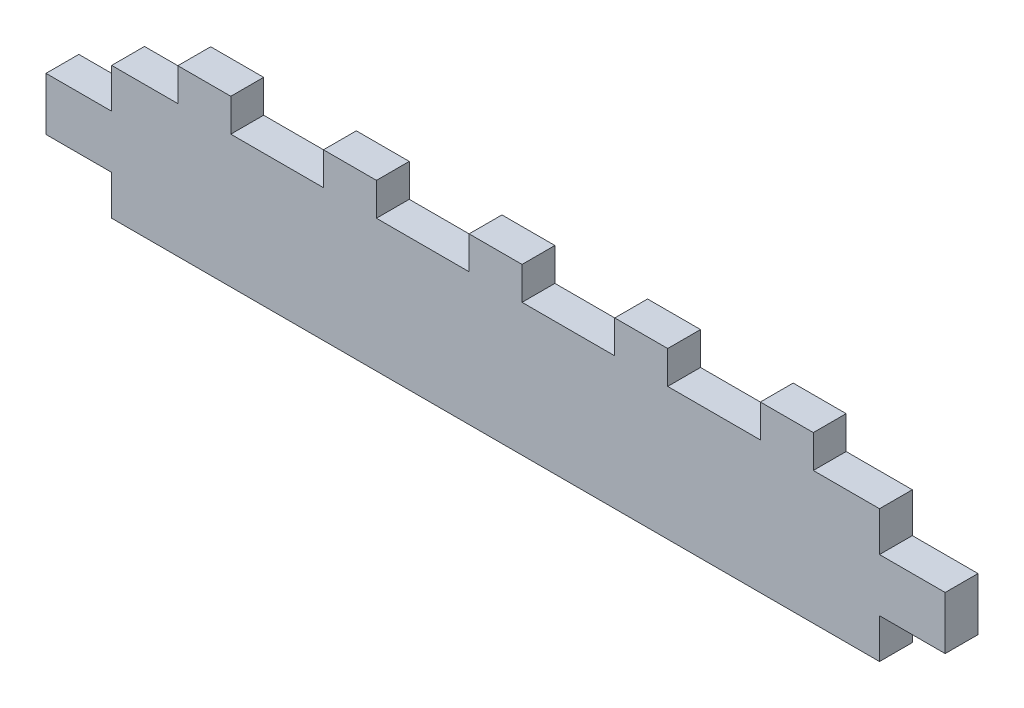
ISO-10303-21;
HEADER;
FILE_DESCRIPTION(('STEP AP214'),'2;1');
FILE_NAME('part.step','',(''),(''),'','','');
FILE_SCHEMA(('AUTOMOTIVE_DESIGN { 1 0 10303 214 1 1 1 1 }'));
ENDSEC;
DATA;
#1=APPLICATION_CONTEXT('core data for automotive mechanical design processes');
#2=APPLICATION_PROTOCOL_DEFINITION('international standard','automotive_design',2000,#1);
#3=PRODUCT_CONTEXT('',#1,'mechanical');
#4=PRODUCT('Part','Part','',(#3));
#5=PRODUCT_RELATED_PRODUCT_CATEGORY('part','',(#4));
#6=PRODUCT_DEFINITION_FORMATION('','',#4);
#7=PRODUCT_DEFINITION_CONTEXT('part definition',#1,'design');
#8=PRODUCT_DEFINITION('design','',#6,#7);
#9=PRODUCT_DEFINITION_SHAPE('','',#8);
#10=(LENGTH_UNIT() NAMED_UNIT(*) SI_UNIT(.MILLI.,.METRE.));
#11=(NAMED_UNIT(*) PLANE_ANGLE_UNIT() SI_UNIT($,.RADIAN.));
#12=(NAMED_UNIT(*) SI_UNIT($,.STERADIAN.) SOLID_ANGLE_UNIT());
#13=UNCERTAINTY_MEASURE_WITH_UNIT(LENGTH_MEASURE(1.E-05),#10,'distance_accuracy_value','');
#14=(GEOMETRIC_REPRESENTATION_CONTEXT(3) GLOBAL_UNCERTAINTY_ASSIGNED_CONTEXT((#13)) GLOBAL_UNIT_ASSIGNED_CONTEXT((#10,
#11,#12)) REPRESENTATION_CONTEXT('',''));
#15=CARTESIAN_POINT('',(0.,0.,0.));
#16=DIRECTION('',(0.,0.,1.));
#17=DIRECTION('',(1.,0.,0.));
#18=AXIS2_PLACEMENT_3D('',#15,#16,#17);
#19=CARTESIAN_POINT('',(-145.,0.,12.4));
#20=DIRECTION('',(1.,0.,0.));
#21=DIRECTION('',(0.,1.,0.));
#22=AXIS2_PLACEMENT_3D('',#19,#20,#21);
#23=PLANE('',#22);
#24=DIRECTION('',(0.,-1.,0.));
#25=VECTOR('',#24,1.);
#26=CARTESIAN_POINT('',(-145.,0.,0.));
#27=LINE('',#26,#25);
#28=CARTESIAN_POINT('',(-145.,15.,0.));
#29=VERTEX_POINT('',#28);
#30=CARTESIAN_POINT('',(-145.,0.,0.));
#31=VERTEX_POINT('',#30);
#32=EDGE_CURVE('E273',#29,#31,#27,.T.);
#33=ORIENTED_EDGE('',*,*,#32,.T.);
#34=DIRECTION('',(0.,0.,-1.));
#35=VECTOR('',#34,1.);
#36=CARTESIAN_POINT('',(-145.,0.,12.4));
#37=LINE('',#36,#35);
#38=CARTESIAN_POINT('',(-145.,0.,12.4));
#39=VERTEX_POINT('',#38);
#40=EDGE_CURVE('E11',#39,#31,#37,.T.);
#41=ORIENTED_EDGE('',*,*,#40,.F.);
#42=DIRECTION('',(0.,-1.,0.));
#43=VECTOR('',#42,1.);
#44=CARTESIAN_POINT('',(-145.,0.,12.4));
#45=LINE('',#44,#43);
#46=CARTESIAN_POINT('',(-145.,15.,12.4));
#47=VERTEX_POINT('',#46);
#48=EDGE_CURVE('E335',#47,#39,#45,.T.);
#49=ORIENTED_EDGE('',*,*,#48,.F.);
#50=DIRECTION('',(0.,0.,-1.));
#51=VECTOR('',#50,1.);
#52=CARTESIAN_POINT('',(-145.,15.,12.4));
#53=LINE('',#52,#51);
#54=EDGE_CURVE('E269',#47,#29,#53,.T.);
#55=ORIENTED_EDGE('',*,*,#54,.T.);
#56=EDGE_LOOP('',(#33,#41,#49,#55));
#57=FACE_BOUND('',#56,.T.);
#58=ADVANCED_FACE('F33',(#57),#23,.F.);
#59=CARTESIAN_POINT('',(-145.,0.,12.4));
#60=DIRECTION('',(0.,1.,0.));
#61=DIRECTION('',(-1.,0.,0.));
#62=AXIS2_PLACEMENT_3D('',#59,#60,#61);
#63=PLANE('',#62);
#64=DIRECTION('',(1.,0.,0.));
#65=VECTOR('',#64,1.);
#66=CARTESIAN_POINT('',(-145.,0.,0.));
#67=LINE('',#66,#65);
#68=CARTESIAN_POINT('',(145.,0.,0.));
#69=VERTEX_POINT('',#68);
#70=EDGE_CURVE('E276',#31,#69,#67,.T.);
#71=ORIENTED_EDGE('',*,*,#70,.T.);
#72=DIRECTION('',(0.,0.,-1.));
#73=VECTOR('',#72,1.);
#74=CARTESIAN_POINT('',(145.,0.,12.4));
#75=LINE('',#74,#73);
#76=CARTESIAN_POINT('',(145.,0.,12.4));
#77=VERTEX_POINT('',#76);
#78=EDGE_CURVE('E41',#77,#69,#75,.T.);
#79=ORIENTED_EDGE('',*,*,#78,.F.);
#80=DIRECTION('',(1.,0.,0.));
#81=VECTOR('',#80,1.);
#82=CARTESIAN_POINT('',(-145.,0.,12.4));
#83=LINE('',#82,#81);
#84=EDGE_CURVE('E164',#39,#77,#83,.T.);
#85=ORIENTED_EDGE('',*,*,#84,.F.);
#86=ORIENTED_EDGE('',*,*,#40,.T.);
#87=EDGE_LOOP('',(#71,#79,#85,#86));
#88=FACE_BOUND('',#87,.T.);
#89=ADVANCED_FACE('F513',(#88),#63,.F.);
#90=CARTESIAN_POINT('',(145.,0.,12.4));
#91=DIRECTION('',(-1.,0.,0.));
#92=DIRECTION('',(0.,-1.,0.));
#93=AXIS2_PLACEMENT_3D('',#90,#91,#92);
#94=PLANE('',#93);
#95=DIRECTION('',(0.,1.,0.));
#96=VECTOR('',#95,1.);
#97=CARTESIAN_POINT('',(145.,0.,0.));
#98=LINE('',#97,#96);
#99=CARTESIAN_POINT('',(145.,15.,0.));
#100=VERTEX_POINT('',#99);
#101=EDGE_CURVE('E278',#69,#100,#98,.T.);
#102=ORIENTED_EDGE('',*,*,#101,.T.);
#103=DIRECTION('',(0.,0.,-1.));
#104=VECTOR('',#103,1.);
#105=CARTESIAN_POINT('',(145.,15.,12.4));
#106=LINE('',#105,#104);
#107=CARTESIAN_POINT('',(145.,15.,12.4));
#108=VERTEX_POINT('',#107);
#109=EDGE_CURVE('E414',#108,#100,#106,.T.);
#110=ORIENTED_EDGE('',*,*,#109,.F.);
#111=DIRECTION('',(0.,1.,0.));
#112=VECTOR('',#111,1.);
#113=CARTESIAN_POINT('',(145.,0.,12.4));
#114=LINE('',#113,#112);
#115=EDGE_CURVE('E422',#77,#108,#114,.T.);
#116=ORIENTED_EDGE('',*,*,#115,.F.);
#117=ORIENTED_EDGE('',*,*,#78,.T.);
#118=EDGE_LOOP('',(#102,#110,#116,#117));
#119=FACE_BOUND('',#118,.T.);
#120=ADVANCED_FACE('F420',(#119),#94,.F.);
#121=CARTESIAN_POINT('',(145.,15.,12.4));
#122=DIRECTION('',(0.,1.,0.));
#123=DIRECTION('',(-1.,0.,0.));
#124=AXIS2_PLACEMENT_3D('',#121,#122,#123);
#125=PLANE('',#124);
#126=DIRECTION('',(1.,0.,0.));
#127=VECTOR('',#126,1.);
#128=CARTESIAN_POINT('',(145.,15.,0.));
#129=LINE('',#128,#127);
#130=CARTESIAN_POINT('',(169.8,15.,0.));
#131=VERTEX_POINT('',#130);
#132=EDGE_CURVE('E280',#100,#131,#129,.T.);
#133=ORIENTED_EDGE('',*,*,#132,.T.);
#134=DIRECTION('',(0.,0.,-1.));
#135=VECTOR('',#134,1.);
#136=CARTESIAN_POINT('',(169.8,15.,12.4));
#137=LINE('',#136,#135);
#138=CARTESIAN_POINT('',(169.8,15.,12.4));
#139=VERTEX_POINT('',#138);
#140=EDGE_CURVE('E411',#139,#131,#137,.T.);
#141=ORIENTED_EDGE('',*,*,#140,.F.);
#142=DIRECTION('',(1.,0.,0.));
#143=VECTOR('',#142,1.);
#144=CARTESIAN_POINT('',(145.,15.,12.4));
#145=LINE('',#144,#143);
#146=EDGE_CURVE('E440',#108,#139,#145,.T.);
#147=ORIENTED_EDGE('',*,*,#146,.F.);
#148=ORIENTED_EDGE('',*,*,#109,.T.);
#149=EDGE_LOOP('',(#133,#141,#147,#148));
#150=FACE_BOUND('',#149,.T.);
#151=ADVANCED_FACE('F431',(#150),#125,.F.);
#152=CARTESIAN_POINT('',(169.8,15.,12.4));
#153=DIRECTION('',(-1.,0.,0.));
#154=DIRECTION('',(0.,-1.,0.));
#155=AXIS2_PLACEMENT_3D('',#152,#153,#154);
#156=PLANE('',#155);
#157=DIRECTION('',(0.,1.,0.));
#158=VECTOR('',#157,1.);
#159=CARTESIAN_POINT('',(169.8,15.,0.));
#160=LINE('',#159,#158);
#161=CARTESIAN_POINT('',(169.8,35.,0.));
#162=VERTEX_POINT('',#161);
#163=EDGE_CURVE('E282',#131,#162,#160,.T.);
#164=ORIENTED_EDGE('',*,*,#163,.T.);
#165=DIRECTION('',(0.,0.,-1.));
#166=VECTOR('',#165,1.);
#167=CARTESIAN_POINT('',(169.8,35.,12.4));
#168=LINE('',#167,#166);
#169=CARTESIAN_POINT('',(169.8,35.,12.4));
#170=VERTEX_POINT('',#169);
#171=EDGE_CURVE('E408',#170,#162,#168,.T.);
#172=ORIENTED_EDGE('',*,*,#171,.F.);
#173=DIRECTION('',(0.,1.,0.));
#174=VECTOR('',#173,1.);
#175=CARTESIAN_POINT('',(169.8,15.,12.4));
#176=LINE('',#175,#174);
#177=EDGE_CURVE('E437',#139,#170,#176,.T.);
#178=ORIENTED_EDGE('',*,*,#177,.F.);
#179=ORIENTED_EDGE('',*,*,#140,.T.);
#180=EDGE_LOOP('',(#164,#172,#178,#179));
#181=FACE_BOUND('',#180,.T.);
#182=ADVANCED_FACE('F435',(#181),#156,.F.);
#183=CARTESIAN_POINT('',(145.,35.,12.4));
#184=DIRECTION('',(0.,-1.,0.));
#185=DIRECTION('',(1.,0.,0.));
#186=AXIS2_PLACEMENT_3D('',#183,#184,#185);
#187=PLANE('',#186);
#188=DIRECTION('',(-1.,0.,0.));
#189=VECTOR('',#188,1.);
#190=CARTESIAN_POINT('',(145.,35.,0.));
#191=LINE('',#190,#189);
#192=CARTESIAN_POINT('',(145.,35.,0.));
#193=VERTEX_POINT('',#192);
#194=EDGE_CURVE('E284',#162,#193,#191,.T.);
#195=ORIENTED_EDGE('',*,*,#194,.T.);
#196=DIRECTION('',(0.,0.,-1.));
#197=VECTOR('',#196,1.);
#198=CARTESIAN_POINT('',(145.,35.,12.4));
#199=LINE('',#198,#197);
#200=CARTESIAN_POINT('',(145.,35.,12.4));
#201=VERTEX_POINT('',#200);
#202=EDGE_CURVE('E405',#201,#193,#199,.T.);
#203=ORIENTED_EDGE('',*,*,#202,.F.);
#204=DIRECTION('',(-1.,0.,0.));
#205=VECTOR('',#204,1.);
#206=CARTESIAN_POINT('',(145.,35.,12.4));
#207=LINE('',#206,#205);
#208=EDGE_CURVE('E439',#170,#201,#207,.T.);
#209=ORIENTED_EDGE('',*,*,#208,.F.);
#210=ORIENTED_EDGE('',*,*,#171,.T.);
#211=EDGE_LOOP('',(#195,#203,#209,#210));
#212=FACE_BOUND('',#211,.T.);
#213=ADVANCED_FACE('F526',(#212),#187,.F.);
#214=CARTESIAN_POINT('',(145.,35.,12.4));
#215=DIRECTION('',(-1.,0.,0.));
#216=DIRECTION('',(0.,0.,1.));
#217=AXIS2_PLACEMENT_3D('',#214,#215,#216);
#218=PLANE('',#217);
#219=DIRECTION('',(0.,1.,0.));
#220=VECTOR('',#219,1.);
#221=CARTESIAN_POINT('',(145.,35.,0.));
#222=LINE('',#221,#220);
#223=CARTESIAN_POINT('',(145.,50.,0.));
#224=VERTEX_POINT('',#223);
#225=EDGE_CURVE('E286',#193,#224,#222,.T.);
#226=ORIENTED_EDGE('',*,*,#225,.T.);
#227=DIRECTION('',(0.,0.,-1.));
#228=VECTOR('',#227,1.);
#229=CARTESIAN_POINT('',(145.,50.,12.4));
#230=LINE('',#229,#228);
#231=CARTESIAN_POINT('',(145.,50.,12.4));
#232=VERTEX_POINT('',#231);
#233=EDGE_CURVE('E402',#232,#224,#230,.T.);
#234=ORIENTED_EDGE('',*,*,#233,.F.);
#235=DIRECTION('',(0.,1.,0.));
#236=VECTOR('',#235,1.);
#237=CARTESIAN_POINT('',(145.,35.,12.4));
#238=LINE('',#237,#236);
#239=EDGE_CURVE('E442',#201,#232,#238,.T.);
#240=ORIENTED_EDGE('',*,*,#239,.F.);
#241=ORIENTED_EDGE('',*,*,#202,.T.);
#242=EDGE_LOOP('',(#226,#234,#240,#241));
#243=FACE_BOUND('',#242,.T.);
#244=ADVANCED_FACE('F529',(#243),#218,.F.);
#245=CARTESIAN_POINT('',(120.,50.,12.4));
#246=DIRECTION('',(0.,-1.,0.));
#247=DIRECTION('',(1.,0.,0.));
#248=AXIS2_PLACEMENT_3D('',#245,#246,#247);
#249=PLANE('',#248);
#250=DIRECTION('',(-1.,0.,0.));
#251=VECTOR('',#250,1.);
#252=CARTESIAN_POINT('',(120.,50.,0.));
#253=LINE('',#252,#251);
#254=CARTESIAN_POINT('',(120.,50.,0.));
#255=VERTEX_POINT('',#254);
#256=EDGE_CURVE('E288',#224,#255,#253,.T.);
#257=ORIENTED_EDGE('',*,*,#256,.T.);
#258=DIRECTION('',(0.,0.,-1.));
#259=VECTOR('',#258,1.);
#260=CARTESIAN_POINT('',(120.,50.,12.4));
#261=LINE('',#260,#259);
#262=CARTESIAN_POINT('',(120.,50.,12.4));
#263=VERTEX_POINT('',#262);
#264=EDGE_CURVE('E399',#263,#255,#261,.T.);
#265=ORIENTED_EDGE('',*,*,#264,.F.);
#266=DIRECTION('',(-1.,0.,0.));
#267=VECTOR('',#266,1.);
#268=CARTESIAN_POINT('',(120.,50.,12.4));
#269=LINE('',#268,#267);
#270=EDGE_CURVE('E448',#232,#263,#269,.T.);
#271=ORIENTED_EDGE('',*,*,#270,.F.);
#272=ORIENTED_EDGE('',*,*,#233,.T.);
#273=EDGE_LOOP('',(#257,#265,#271,#272));
#274=FACE_BOUND('',#273,.T.);
#275=ADVANCED_FACE('F533',(#274),#249,.F.);
#276=CARTESIAN_POINT('',(120.,62.4,12.4));
#277=DIRECTION('',(-1.,0.,0.));
#278=DIRECTION('',(0.,0.,1.));
#279=AXIS2_PLACEMENT_3D('',#276,#277,#278);
#280=PLANE('',#279);
#281=DIRECTION('',(0.,1.,0.));
#282=VECTOR('',#281,1.);
#283=CARTESIAN_POINT('',(120.,62.4,0.));
#284=LINE('',#283,#282);
#285=CARTESIAN_POINT('',(120.,62.4,0.));
#286=VERTEX_POINT('',#285);
#287=EDGE_CURVE('E290',#255,#286,#284,.T.);
#288=ORIENTED_EDGE('',*,*,#287,.T.);
#289=DIRECTION('',(0.,0.,-1.));
#290=VECTOR('',#289,1.);
#291=CARTESIAN_POINT('',(120.,62.4,12.4));
#292=LINE('',#291,#290);
#293=CARTESIAN_POINT('',(120.,62.4,12.4));
#294=VERTEX_POINT('',#293);
#295=EDGE_CURVE('E396',#294,#286,#292,.T.);
#296=ORIENTED_EDGE('',*,*,#295,.F.);
#297=DIRECTION('',(0.,1.,0.));
#298=VECTOR('',#297,1.);
#299=CARTESIAN_POINT('',(120.,62.4,12.4));
#300=LINE('',#299,#298);
#301=EDGE_CURVE('E450',#263,#294,#300,.T.);
#302=ORIENTED_EDGE('',*,*,#301,.F.);
#303=ORIENTED_EDGE('',*,*,#264,.T.);
#304=EDGE_LOOP('',(#288,#296,#302,#303));
#305=FACE_BOUND('',#304,.T.);
#306=ADVANCED_FACE('F537',(#305),#280,.F.);
#307=CARTESIAN_POINT('',(120.,62.4,12.4));
#308=DIRECTION('',(0.,-1.,0.));
#309=DIRECTION('',(0.,0.,-1.));
#310=AXIS2_PLACEMENT_3D('',#307,#308,#309);
#311=PLANE('',#310);
#312=DIRECTION('',(-1.,0.,0.));
#313=VECTOR('',#312,1.);
#314=CARTESIAN_POINT('',(120.,62.4,0.));
#315=LINE('',#314,#313);
#316=CARTESIAN_POINT('',(100.,62.4,0.));
#317=VERTEX_POINT('',#316);
#318=EDGE_CURVE('E292',#286,#317,#315,.T.);
#319=ORIENTED_EDGE('',*,*,#318,.T.);
#320=DIRECTION('',(0.,0.,-1.));
#321=VECTOR('',#320,1.);
#322=CARTESIAN_POINT('',(100.,62.4,12.4));
#323=LINE('',#322,#321);
#324=CARTESIAN_POINT('',(100.,62.4,12.4));
#325=VERTEX_POINT('',#324);
#326=EDGE_CURVE('E393',#325,#317,#323,.T.);
#327=ORIENTED_EDGE('',*,*,#326,.F.);
#328=DIRECTION('',(-1.,0.,0.));
#329=VECTOR('',#328,1.);
#330=CARTESIAN_POINT('',(120.,62.4,12.4));
#331=LINE('',#330,#329);
#332=EDGE_CURVE('E452',#294,#325,#331,.T.);
#333=ORIENTED_EDGE('',*,*,#332,.F.);
#334=ORIENTED_EDGE('',*,*,#295,.T.);
#335=EDGE_LOOP('',(#319,#327,#333,#334));
#336=FACE_BOUND('',#335,.T.);
#337=ADVANCED_FACE('F541',(#336),#311,.F.);
#338=CARTESIAN_POINT('',(100.,62.4,12.4));
#339=DIRECTION('',(1.,0.,0.));
#340=DIRECTION('',(0.,1.,0.));
#341=AXIS2_PLACEMENT_3D('',#338,#339,#340);
#342=PLANE('',#341);
#343=DIRECTION('',(0.,-1.,0.));
#344=VECTOR('',#343,1.);
#345=CARTESIAN_POINT('',(100.,62.4,0.));
#346=LINE('',#345,#344);
#347=CARTESIAN_POINT('',(100.,50.,0.));
#348=VERTEX_POINT('',#347);
#349=EDGE_CURVE('E294',#317,#348,#346,.T.);
#350=ORIENTED_EDGE('',*,*,#349,.T.);
#351=DIRECTION('',(0.,0.,-1.));
#352=VECTOR('',#351,1.);
#353=CARTESIAN_POINT('',(100.,50.,12.4));
#354=LINE('',#353,#352);
#355=CARTESIAN_POINT('',(100.,50.,12.4));
#356=VERTEX_POINT('',#355);
#357=EDGE_CURVE('E390',#356,#348,#354,.T.);
#358=ORIENTED_EDGE('',*,*,#357,.F.);
#359=DIRECTION('',(0.,-1.,0.));
#360=VECTOR('',#359,1.);
#361=CARTESIAN_POINT('',(100.,62.4,12.4));
#362=LINE('',#361,#360);
#363=EDGE_CURVE('E454',#325,#356,#362,.T.);
#364=ORIENTED_EDGE('',*,*,#363,.F.);
#365=ORIENTED_EDGE('',*,*,#326,.T.);
#366=EDGE_LOOP('',(#350,#358,#364,#365));
#367=FACE_BOUND('',#366,.T.);
#368=ADVANCED_FACE('F545',(#367),#342,.F.);
#369=CARTESIAN_POINT('',(65.,50.,12.4));
#370=DIRECTION('',(0.,-1.,0.));
#371=DIRECTION('',(0.,0.,-1.));
#372=AXIS2_PLACEMENT_3D('',#369,#370,#371);
#373=PLANE('',#372);
#374=DIRECTION('',(-1.,0.,0.));
#375=VECTOR('',#374,1.);
#376=CARTESIAN_POINT('',(65.,50.,0.));
#377=LINE('',#376,#375);
#378=CARTESIAN_POINT('',(65.,50.,0.));
#379=VERTEX_POINT('',#378);
#380=EDGE_CURVE('E296',#348,#379,#377,.T.);
#381=ORIENTED_EDGE('',*,*,#380,.T.);
#382=DIRECTION('',(0.,0.,-1.));
#383=VECTOR('',#382,1.);
#384=CARTESIAN_POINT('',(65.,50.,12.4));
#385=LINE('',#384,#383);
#386=CARTESIAN_POINT('',(65.,50.,12.4));
#387=VERTEX_POINT('',#386);
#388=EDGE_CURVE('E387',#387,#379,#385,.T.);
#389=ORIENTED_EDGE('',*,*,#388,.F.);
#390=DIRECTION('',(-1.,0.,0.));
#391=VECTOR('',#390,1.);
#392=CARTESIAN_POINT('',(65.,50.,12.4));
#393=LINE('',#392,#391);
#394=EDGE_CURVE('E456',#356,#387,#393,.T.);
#395=ORIENTED_EDGE('',*,*,#394,.F.);
#396=ORIENTED_EDGE('',*,*,#357,.T.);
#397=EDGE_LOOP('',(#381,#389,#395,#396));
#398=FACE_BOUND('',#397,.T.);
#399=ADVANCED_FACE('F549',(#398),#373,.F.);
#400=CARTESIAN_POINT('',(65.,62.4,12.4));
#401=DIRECTION('',(-1.,0.,0.));
#402=DIRECTION('',(0.,0.,1.));
#403=AXIS2_PLACEMENT_3D('',#400,#401,#402);
#404=PLANE('',#403);
#405=DIRECTION('',(0.,1.,0.));
#406=VECTOR('',#405,1.);
#407=CARTESIAN_POINT('',(65.,62.4,0.));
#408=LINE('',#407,#406);
#409=CARTESIAN_POINT('',(65.,62.4,0.));
#410=VERTEX_POINT('',#409);
#411=EDGE_CURVE('E298',#379,#410,#408,.T.);
#412=ORIENTED_EDGE('',*,*,#411,.T.);
#413=DIRECTION('',(0.,0.,-1.));
#414=VECTOR('',#413,1.);
#415=CARTESIAN_POINT('',(65.,62.4,12.4));
#416=LINE('',#415,#414);
#417=CARTESIAN_POINT('',(65.,62.4,12.4));
#418=VERTEX_POINT('',#417);
#419=EDGE_CURVE('E384',#418,#410,#416,.T.);
#420=ORIENTED_EDGE('',*,*,#419,.F.);
#421=DIRECTION('',(0.,1.,0.));
#422=VECTOR('',#421,1.);
#423=CARTESIAN_POINT('',(65.,62.4,12.4));
#424=LINE('',#423,#422);
#425=EDGE_CURVE('E458',#387,#418,#424,.T.);
#426=ORIENTED_EDGE('',*,*,#425,.F.);
#427=ORIENTED_EDGE('',*,*,#388,.T.);
#428=EDGE_LOOP('',(#412,#420,#426,#427));
#429=FACE_BOUND('',#428,.T.);
#430=ADVANCED_FACE('F553',(#429),#404,.F.);
#431=CARTESIAN_POINT('',(65.,62.4,12.4));
#432=DIRECTION('',(0.,-1.,0.));
#433=DIRECTION('',(0.,0.,-1.));
#434=AXIS2_PLACEMENT_3D('',#431,#432,#433);
#435=PLANE('',#434);
#436=DIRECTION('',(-1.,0.,0.));
#437=VECTOR('',#436,1.);
#438=CARTESIAN_POINT('',(65.,62.4,0.));
#439=LINE('',#438,#437);
#440=CARTESIAN_POINT('',(45.,62.4,0.));
#441=VERTEX_POINT('',#440);
#442=EDGE_CURVE('E300',#410,#441,#439,.T.);
#443=ORIENTED_EDGE('',*,*,#442,.T.);
#444=DIRECTION('',(0.,0.,-1.));
#445=VECTOR('',#444,1.);
#446=CARTESIAN_POINT('',(45.,62.4,12.4));
#447=LINE('',#446,#445);
#448=CARTESIAN_POINT('',(45.,62.4,12.4));
#449=VERTEX_POINT('',#448);
#450=EDGE_CURVE('E381',#449,#441,#447,.T.);
#451=ORIENTED_EDGE('',*,*,#450,.F.);
#452=DIRECTION('',(-1.,0.,0.));
#453=VECTOR('',#452,1.);
#454=CARTESIAN_POINT('',(65.,62.4,12.4));
#455=LINE('',#454,#453);
#456=EDGE_CURVE('E460',#418,#449,#455,.T.);
#457=ORIENTED_EDGE('',*,*,#456,.F.);
#458=ORIENTED_EDGE('',*,*,#419,.T.);
#459=EDGE_LOOP('',(#443,#451,#457,#458));
#460=FACE_BOUND('',#459,.T.);
#461=ADVANCED_FACE('F557',(#460),#435,.F.);
#462=CARTESIAN_POINT('',(45.,62.4,12.4));
#463=DIRECTION('',(1.,0.,0.));
#464=DIRECTION('',(0.,1.,0.));
#465=AXIS2_PLACEMENT_3D('',#462,#463,#464);
#466=PLANE('',#465);
#467=DIRECTION('',(0.,-1.,0.));
#468=VECTOR('',#467,1.);
#469=CARTESIAN_POINT('',(45.,62.4,0.));
#470=LINE('',#469,#468);
#471=CARTESIAN_POINT('',(45.,50.,0.));
#472=VERTEX_POINT('',#471);
#473=EDGE_CURVE('E302',#441,#472,#470,.T.);
#474=ORIENTED_EDGE('',*,*,#473,.T.);
#475=DIRECTION('',(0.,0.,-1.));
#476=VECTOR('',#475,1.);
#477=CARTESIAN_POINT('',(45.,50.,12.4));
#478=LINE('',#477,#476);
#479=CARTESIAN_POINT('',(45.,50.,12.4));
#480=VERTEX_POINT('',#479);
#481=EDGE_CURVE('E378',#480,#472,#478,.T.);
#482=ORIENTED_EDGE('',*,*,#481,.F.);
#483=DIRECTION('',(0.,-1.,0.));
#484=VECTOR('',#483,1.);
#485=CARTESIAN_POINT('',(45.,62.4,12.4));
#486=LINE('',#485,#484);
#487=EDGE_CURVE('E462',#449,#480,#486,.T.);
#488=ORIENTED_EDGE('',*,*,#487,.F.);
#489=ORIENTED_EDGE('',*,*,#450,.T.);
#490=EDGE_LOOP('',(#474,#482,#488,#489));
#491=FACE_BOUND('',#490,.T.);
#492=ADVANCED_FACE('F561',(#491),#466,.F.);
#493=CARTESIAN_POINT('',(9.99999999999999,50.,12.4));
#494=DIRECTION('',(0.,-1.,0.));
#495=DIRECTION('',(0.,0.,-1.));
#496=AXIS2_PLACEMENT_3D('',#493,#494,#495);
#497=PLANE('',#496);
#498=DIRECTION('',(-1.,0.,0.));
#499=VECTOR('',#498,1.);
#500=CARTESIAN_POINT('',(9.99999999999999,50.,0.));
#501=LINE('',#500,#499);
#502=CARTESIAN_POINT('',(9.99999999999999,50.,0.));
#503=VERTEX_POINT('',#502);
#504=EDGE_CURVE('E304',#472,#503,#501,.T.);
#505=ORIENTED_EDGE('',*,*,#504,.T.);
#506=DIRECTION('',(0.,0.,-1.));
#507=VECTOR('',#506,1.);
#508=CARTESIAN_POINT('',(9.99999999999999,50.,12.4));
#509=LINE('',#508,#507);
#510=CARTESIAN_POINT('',(9.99999999999999,50.,12.4));
#511=VERTEX_POINT('',#510);
#512=EDGE_CURVE('E375',#511,#503,#509,.T.);
#513=ORIENTED_EDGE('',*,*,#512,.F.);
#514=DIRECTION('',(-1.,0.,0.));
#515=VECTOR('',#514,1.);
#516=CARTESIAN_POINT('',(9.99999999999999,50.,12.4));
#517=LINE('',#516,#515);
#518=EDGE_CURVE('E464',#480,#511,#517,.T.);
#519=ORIENTED_EDGE('',*,*,#518,.F.);
#520=ORIENTED_EDGE('',*,*,#481,.T.);
#521=EDGE_LOOP('',(#505,#513,#519,#520));
#522=FACE_BOUND('',#521,.T.);
#523=ADVANCED_FACE('F565',(#522),#497,.F.);
#524=CARTESIAN_POINT('',(9.99999999999999,62.4,12.4));
#525=DIRECTION('',(-1.,0.,0.));
#526=DIRECTION('',(0.,0.,1.));
#527=AXIS2_PLACEMENT_3D('',#524,#525,#526);
#528=PLANE('',#527);
#529=DIRECTION('',(0.,1.,0.));
#530=VECTOR('',#529,1.);
#531=CARTESIAN_POINT('',(9.99999999999999,62.4,0.));
#532=LINE('',#531,#530);
#533=CARTESIAN_POINT('',(9.99999999999999,62.4,0.));
#534=VERTEX_POINT('',#533);
#535=EDGE_CURVE('E306',#503,#534,#532,.T.);
#536=ORIENTED_EDGE('',*,*,#535,.T.);
#537=DIRECTION('',(0.,0.,-1.));
#538=VECTOR('',#537,1.);
#539=CARTESIAN_POINT('',(9.99999999999999,62.4,12.4));
#540=LINE('',#539,#538);
#541=CARTESIAN_POINT('',(9.99999999999999,62.4,12.4));
#542=VERTEX_POINT('',#541);
#543=EDGE_CURVE('E372',#542,#534,#540,.T.);
#544=ORIENTED_EDGE('',*,*,#543,.F.);
#545=DIRECTION('',(0.,1.,0.));
#546=VECTOR('',#545,1.);
#547=CARTESIAN_POINT('',(9.99999999999999,62.4,12.4));
#548=LINE('',#547,#546);
#549=EDGE_CURVE('E466',#511,#542,#548,.T.);
#550=ORIENTED_EDGE('',*,*,#549,.F.);
#551=ORIENTED_EDGE('',*,*,#512,.T.);
#552=EDGE_LOOP('',(#536,#544,#550,#551));
#553=FACE_BOUND('',#552,.T.);
#554=ADVANCED_FACE('F569',(#553),#528,.F.);
#555=CARTESIAN_POINT('',(9.99999999999999,62.4,12.4));
#556=DIRECTION('',(0.,-1.,0.));
#557=DIRECTION('',(0.,0.,-1.));
#558=AXIS2_PLACEMENT_3D('',#555,#556,#557);
#559=PLANE('',#558);
#560=DIRECTION('',(-1.,0.,0.));
#561=VECTOR('',#560,1.);
#562=CARTESIAN_POINT('',(9.99999999999999,62.4,0.));
#563=LINE('',#562,#561);
#564=CARTESIAN_POINT('',(-10.,62.4,0.));
#565=VERTEX_POINT('',#564);
#566=EDGE_CURVE('E308',#534,#565,#563,.T.);
#567=ORIENTED_EDGE('',*,*,#566,.T.);
#568=DIRECTION('',(0.,0.,-1.));
#569=VECTOR('',#568,1.);
#570=CARTESIAN_POINT('',(-10.,62.4,12.4));
#571=LINE('',#570,#569);
#572=CARTESIAN_POINT('',(-10.,62.4,12.4));
#573=VERTEX_POINT('',#572);
#574=EDGE_CURVE('E369',#573,#565,#571,.T.);
#575=ORIENTED_EDGE('',*,*,#574,.F.);
#576=DIRECTION('',(-1.,0.,0.));
#577=VECTOR('',#576,1.);
#578=CARTESIAN_POINT('',(9.99999999999999,62.4,12.4));
#579=LINE('',#578,#577);
#580=EDGE_CURVE('E468',#542,#573,#579,.T.);
#581=ORIENTED_EDGE('',*,*,#580,.F.);
#582=ORIENTED_EDGE('',*,*,#543,.T.);
#583=EDGE_LOOP('',(#567,#575,#581,#582));
#584=FACE_BOUND('',#583,.T.);
#585=ADVANCED_FACE('F573',(#584),#559,.F.);
#586=CARTESIAN_POINT('',(-10.,62.4,12.4));
#587=DIRECTION('',(1.,0.,0.));
#588=DIRECTION('',(0.,1.,0.));
#589=AXIS2_PLACEMENT_3D('',#586,#587,#588);
#590=PLANE('',#589);
#591=DIRECTION('',(0.,-1.,0.));
#592=VECTOR('',#591,1.);
#593=CARTESIAN_POINT('',(-10.,62.4,0.));
#594=LINE('',#593,#592);
#595=CARTESIAN_POINT('',(-9.99999999999999,50.,0.));
#596=VERTEX_POINT('',#595);
#597=EDGE_CURVE('E310',#565,#596,#594,.T.);
#598=ORIENTED_EDGE('',*,*,#597,.T.);
#599=DIRECTION('',(0.,0.,-1.));
#600=VECTOR('',#599,1.);
#601=CARTESIAN_POINT('',(-9.99999999999999,50.,12.4));
#602=LINE('',#601,#600);
#603=CARTESIAN_POINT('',(-9.99999999999999,50.,12.4));
#604=VERTEX_POINT('',#603);
#605=EDGE_CURVE('E366',#604,#596,#602,.T.);
#606=ORIENTED_EDGE('',*,*,#605,.F.);
#607=DIRECTION('',(0.,-1.,0.));
#608=VECTOR('',#607,1.);
#609=CARTESIAN_POINT('',(-10.,62.4,12.4));
#610=LINE('',#609,#608);
#611=EDGE_CURVE('E470',#573,#604,#610,.T.);
#612=ORIENTED_EDGE('',*,*,#611,.F.);
#613=ORIENTED_EDGE('',*,*,#574,.T.);
#614=EDGE_LOOP('',(#598,#606,#612,#613));
#615=FACE_BOUND('',#614,.T.);
#616=ADVANCED_FACE('F577',(#615),#590,.F.);
#617=CARTESIAN_POINT('',(-45.,50.,12.4));
#618=DIRECTION('',(0.,-1.,0.));
#619=DIRECTION('',(0.,0.,-1.));
#620=AXIS2_PLACEMENT_3D('',#617,#618,#619);
#621=PLANE('',#620);
#622=DIRECTION('',(-1.,0.,0.));
#623=VECTOR('',#622,1.);
#624=CARTESIAN_POINT('',(-45.,50.,0.));
#625=LINE('',#624,#623);
#626=CARTESIAN_POINT('',(-45.,50.,0.));
#627=VERTEX_POINT('',#626);
#628=EDGE_CURVE('E312',#596,#627,#625,.T.);
#629=ORIENTED_EDGE('',*,*,#628,.T.);
#630=DIRECTION('',(0.,0.,-1.));
#631=VECTOR('',#630,1.);
#632=CARTESIAN_POINT('',(-45.,50.,12.4));
#633=LINE('',#632,#631);
#634=CARTESIAN_POINT('',(-45.,50.,12.4));
#635=VERTEX_POINT('',#634);
#636=EDGE_CURVE('E363',#635,#627,#633,.T.);
#637=ORIENTED_EDGE('',*,*,#636,.F.);
#638=DIRECTION('',(-1.,0.,0.));
#639=VECTOR('',#638,1.);
#640=CARTESIAN_POINT('',(-45.,50.,12.4));
#641=LINE('',#640,#639);
#642=EDGE_CURVE('E472',#604,#635,#641,.T.);
#643=ORIENTED_EDGE('',*,*,#642,.F.);
#644=ORIENTED_EDGE('',*,*,#605,.T.);
#645=EDGE_LOOP('',(#629,#637,#643,#644));
#646=FACE_BOUND('',#645,.T.);
#647=ADVANCED_FACE('F581',(#646),#621,.F.);
#648=CARTESIAN_POINT('',(-45.,62.4,12.4));
#649=DIRECTION('',(-1.,0.,0.));
#650=DIRECTION('',(0.,0.,1.));
#651=AXIS2_PLACEMENT_3D('',#648,#649,#650);
#652=PLANE('',#651);
#653=DIRECTION('',(0.,1.,0.));
#654=VECTOR('',#653,1.);
#655=CARTESIAN_POINT('',(-45.,62.4,0.));
#656=LINE('',#655,#654);
#657=CARTESIAN_POINT('',(-45.,62.4,0.));
#658=VERTEX_POINT('',#657);
#659=EDGE_CURVE('E314',#627,#658,#656,.T.);
#660=ORIENTED_EDGE('',*,*,#659,.T.);
#661=DIRECTION('',(0.,0.,-1.));
#662=VECTOR('',#661,1.);
#663=CARTESIAN_POINT('',(-45.,62.4,12.4));
#664=LINE('',#663,#662);
#665=CARTESIAN_POINT('',(-45.,62.4,12.4));
#666=VERTEX_POINT('',#665);
#667=EDGE_CURVE('E360',#666,#658,#664,.T.);
#668=ORIENTED_EDGE('',*,*,#667,.F.);
#669=DIRECTION('',(0.,1.,0.));
#670=VECTOR('',#669,1.);
#671=CARTESIAN_POINT('',(-45.,62.4,12.4));
#672=LINE('',#671,#670);
#673=EDGE_CURVE('E474',#635,#666,#672,.T.);
#674=ORIENTED_EDGE('',*,*,#673,.F.);
#675=ORIENTED_EDGE('',*,*,#636,.T.);
#676=EDGE_LOOP('',(#660,#668,#674,#675));
#677=FACE_BOUND('',#676,.T.);
#678=ADVANCED_FACE('F585',(#677),#652,.F.);
#679=CARTESIAN_POINT('',(-45.,62.4,12.4));
#680=DIRECTION('',(0.,-1.,0.));
#681=DIRECTION('',(0.,0.,-1.));
#682=AXIS2_PLACEMENT_3D('',#679,#680,#681);
#683=PLANE('',#682);
#684=DIRECTION('',(-1.,0.,0.));
#685=VECTOR('',#684,1.);
#686=CARTESIAN_POINT('',(-45.,62.4,0.));
#687=LINE('',#686,#685);
#688=CARTESIAN_POINT('',(-65.,62.4,0.));
#689=VERTEX_POINT('',#688);
#690=EDGE_CURVE('E316',#658,#689,#687,.T.);
#691=ORIENTED_EDGE('',*,*,#690,.T.);
#692=DIRECTION('',(0.,0.,-1.));
#693=VECTOR('',#692,1.);
#694=CARTESIAN_POINT('',(-65.,62.4,12.4));
#695=LINE('',#694,#693);
#696=CARTESIAN_POINT('',(-65.,62.4,12.4));
#697=VERTEX_POINT('',#696);
#698=EDGE_CURVE('E357',#697,#689,#695,.T.);
#699=ORIENTED_EDGE('',*,*,#698,.F.);
#700=DIRECTION('',(-1.,0.,0.));
#701=VECTOR('',#700,1.);
#702=CARTESIAN_POINT('',(-45.,62.4,12.4));
#703=LINE('',#702,#701);
#704=EDGE_CURVE('E476',#666,#697,#703,.T.);
#705=ORIENTED_EDGE('',*,*,#704,.F.);
#706=ORIENTED_EDGE('',*,*,#667,.T.);
#707=EDGE_LOOP('',(#691,#699,#705,#706));
#708=FACE_BOUND('',#707,.T.);
#709=ADVANCED_FACE('F589',(#708),#683,.F.);
#710=CARTESIAN_POINT('',(-65.,62.4,12.4));
#711=DIRECTION('',(1.,0.,0.));
#712=DIRECTION('',(0.,0.,-1.));
#713=AXIS2_PLACEMENT_3D('',#710,#711,#712);
#714=PLANE('',#713);
#715=DIRECTION('',(0.,-1.,0.));
#716=VECTOR('',#715,1.);
#717=CARTESIAN_POINT('',(-65.,62.4,0.));
#718=LINE('',#717,#716);
#719=CARTESIAN_POINT('',(-65.,50.,0.));
#720=VERTEX_POINT('',#719);
#721=EDGE_CURVE('E318',#689,#720,#718,.T.);
#722=ORIENTED_EDGE('',*,*,#721,.T.);
#723=DIRECTION('',(0.,0.,-1.));
#724=VECTOR('',#723,1.);
#725=CARTESIAN_POINT('',(-65.,50.,12.4));
#726=LINE('',#725,#724);
#727=CARTESIAN_POINT('',(-65.,50.,12.4));
#728=VERTEX_POINT('',#727);
#729=EDGE_CURVE('E354',#728,#720,#726,.T.);
#730=ORIENTED_EDGE('',*,*,#729,.F.);
#731=DIRECTION('',(0.,-1.,0.));
#732=VECTOR('',#731,1.);
#733=CARTESIAN_POINT('',(-65.,62.4,12.4));
#734=LINE('',#733,#732);
#735=EDGE_CURVE('E478',#697,#728,#734,.T.);
#736=ORIENTED_EDGE('',*,*,#735,.F.);
#737=ORIENTED_EDGE('',*,*,#698,.T.);
#738=EDGE_LOOP('',(#722,#730,#736,#737));
#739=FACE_BOUND('',#738,.T.);
#740=ADVANCED_FACE('F593',(#739),#714,.F.);
#741=CARTESIAN_POINT('',(-100.,50.,12.4));
#742=DIRECTION('',(0.,-1.,0.));
#743=DIRECTION('',(0.,0.,-1.));
#744=AXIS2_PLACEMENT_3D('',#741,#742,#743);
#745=PLANE('',#744);
#746=DIRECTION('',(-1.,0.,0.));
#747=VECTOR('',#746,1.);
#748=CARTESIAN_POINT('',(-100.,50.,0.));
#749=LINE('',#748,#747);
#750=CARTESIAN_POINT('',(-100.,50.,0.));
#751=VERTEX_POINT('',#750);
#752=EDGE_CURVE('E320',#720,#751,#749,.T.);
#753=ORIENTED_EDGE('',*,*,#752,.T.);
#754=DIRECTION('',(0.,0.,-1.));
#755=VECTOR('',#754,1.);
#756=CARTESIAN_POINT('',(-100.,50.,12.4));
#757=LINE('',#756,#755);
#758=CARTESIAN_POINT('',(-100.,50.,12.4));
#759=VERTEX_POINT('',#758);
#760=EDGE_CURVE('E351',#759,#751,#757,.T.);
#761=ORIENTED_EDGE('',*,*,#760,.F.);
#762=DIRECTION('',(-1.,0.,0.));
#763=VECTOR('',#762,1.);
#764=CARTESIAN_POINT('',(-100.,50.,12.4));
#765=LINE('',#764,#763);
#766=EDGE_CURVE('E480',#728,#759,#765,.T.);
#767=ORIENTED_EDGE('',*,*,#766,.F.);
#768=ORIENTED_EDGE('',*,*,#729,.T.);
#769=EDGE_LOOP('',(#753,#761,#767,#768));
#770=FACE_BOUND('',#769,.T.);
#771=ADVANCED_FACE('F597',(#770),#745,.F.);
#772=CARTESIAN_POINT('',(-100.,62.4,12.4));
#773=DIRECTION('',(-1.,0.,0.));
#774=DIRECTION('',(0.,0.,1.));
#775=AXIS2_PLACEMENT_3D('',#772,#773,#774);
#776=PLANE('',#775);
#777=DIRECTION('',(0.,1.,0.));
#778=VECTOR('',#777,1.);
#779=CARTESIAN_POINT('',(-100.,62.4,0.));
#780=LINE('',#779,#778);
#781=CARTESIAN_POINT('',(-100.,62.4,0.));
#782=VERTEX_POINT('',#781);
#783=EDGE_CURVE('E322',#751,#782,#780,.T.);
#784=ORIENTED_EDGE('',*,*,#783,.T.);
#785=DIRECTION('',(0.,0.,-1.));
#786=VECTOR('',#785,1.);
#787=CARTESIAN_POINT('',(-100.,62.4,12.4));
#788=LINE('',#787,#786);
#789=CARTESIAN_POINT('',(-100.,62.4,12.4));
#790=VERTEX_POINT('',#789);
#791=EDGE_CURVE('E348',#790,#782,#788,.T.);
#792=ORIENTED_EDGE('',*,*,#791,.F.);
#793=DIRECTION('',(0.,1.,0.));
#794=VECTOR('',#793,1.);
#795=CARTESIAN_POINT('',(-100.,62.4,12.4));
#796=LINE('',#795,#794);
#797=EDGE_CURVE('E482',#759,#790,#796,.T.);
#798=ORIENTED_EDGE('',*,*,#797,.F.);
#799=ORIENTED_EDGE('',*,*,#760,.T.);
#800=EDGE_LOOP('',(#784,#792,#798,#799));
#801=FACE_BOUND('',#800,.T.);
#802=ADVANCED_FACE('F601',(#801),#776,.F.);
#803=CARTESIAN_POINT('',(-100.,62.4,12.4));
#804=DIRECTION('',(0.,-1.,0.));
#805=DIRECTION('',(0.,0.,-1.));
#806=AXIS2_PLACEMENT_3D('',#803,#804,#805);
#807=PLANE('',#806);
#808=DIRECTION('',(-1.,0.,0.));
#809=VECTOR('',#808,1.);
#810=CARTESIAN_POINT('',(-100.,62.4,0.));
#811=LINE('',#810,#809);
#812=CARTESIAN_POINT('',(-120.,62.4,0.));
#813=VERTEX_POINT('',#812);
#814=EDGE_CURVE('E324',#782,#813,#811,.T.);
#815=ORIENTED_EDGE('',*,*,#814,.T.);
#816=DIRECTION('',(0.,0.,-1.));
#817=VECTOR('',#816,1.);
#818=CARTESIAN_POINT('',(-120.,62.4,12.4));
#819=LINE('',#818,#817);
#820=CARTESIAN_POINT('',(-120.,62.4,12.4));
#821=VERTEX_POINT('',#820);
#822=EDGE_CURVE('E345',#821,#813,#819,.T.);
#823=ORIENTED_EDGE('',*,*,#822,.F.);
#824=DIRECTION('',(-1.,0.,0.));
#825=VECTOR('',#824,1.);
#826=CARTESIAN_POINT('',(-100.,62.4,12.4));
#827=LINE('',#826,#825);
#828=EDGE_CURVE('E484',#790,#821,#827,.T.);
#829=ORIENTED_EDGE('',*,*,#828,.F.);
#830=ORIENTED_EDGE('',*,*,#791,.T.);
#831=EDGE_LOOP('',(#815,#823,#829,#830));
#832=FACE_BOUND('',#831,.T.);
#833=ADVANCED_FACE('F605',(#832),#807,.F.);
#834=CARTESIAN_POINT('',(-120.,62.4,12.4));
#835=DIRECTION('',(1.,0.,0.));
#836=DIRECTION('',(0.,0.,-1.));
#837=AXIS2_PLACEMENT_3D('',#834,#835,#836);
#838=PLANE('',#837);
#839=DIRECTION('',(0.,-1.,0.));
#840=VECTOR('',#839,1.);
#841=CARTESIAN_POINT('',(-120.,62.4,0.));
#842=LINE('',#841,#840);
#843=CARTESIAN_POINT('',(-120.,50.,0.));
#844=VERTEX_POINT('',#843);
#845=EDGE_CURVE('E326',#813,#844,#842,.T.);
#846=ORIENTED_EDGE('',*,*,#845,.T.);
#847=DIRECTION('',(0.,0.,-1.));
#848=VECTOR('',#847,1.);
#849=CARTESIAN_POINT('',(-120.,50.,12.4));
#850=LINE('',#849,#848);
#851=CARTESIAN_POINT('',(-120.,50.,12.4));
#852=VERTEX_POINT('',#851);
#853=EDGE_CURVE('E342',#852,#844,#850,.T.);
#854=ORIENTED_EDGE('',*,*,#853,.F.);
#855=DIRECTION('',(0.,-1.,0.));
#856=VECTOR('',#855,1.);
#857=CARTESIAN_POINT('',(-120.,62.4,12.4));
#858=LINE('',#857,#856);
#859=EDGE_CURVE('E486',#821,#852,#858,.T.);
#860=ORIENTED_EDGE('',*,*,#859,.F.);
#861=ORIENTED_EDGE('',*,*,#822,.T.);
#862=EDGE_LOOP('',(#846,#854,#860,#861));
#863=FACE_BOUND('',#862,.T.);
#864=ADVANCED_FACE('F609',(#863),#838,.F.);
#865=CARTESIAN_POINT('',(-145.,50.,12.4));
#866=DIRECTION('',(0.,-1.,0.));
#867=DIRECTION('',(1.,0.,0.));
#868=AXIS2_PLACEMENT_3D('',#865,#866,#867);
#869=PLANE('',#868);
#870=DIRECTION('',(-1.,0.,0.));
#871=VECTOR('',#870,1.);
#872=CARTESIAN_POINT('',(-145.,50.,0.));
#873=LINE('',#872,#871);
#874=CARTESIAN_POINT('',(-145.,50.,0.));
#875=VERTEX_POINT('',#874);
#876=EDGE_CURVE('E328',#844,#875,#873,.T.);
#877=ORIENTED_EDGE('',*,*,#876,.T.);
#878=DIRECTION('',(0.,0.,-1.));
#879=VECTOR('',#878,1.);
#880=CARTESIAN_POINT('',(-145.,50.,12.4));
#881=LINE('',#880,#879);
#882=CARTESIAN_POINT('',(-145.,50.,12.4));
#883=VERTEX_POINT('',#882);
#884=EDGE_CURVE('E339',#883,#875,#881,.T.);
#885=ORIENTED_EDGE('',*,*,#884,.F.);
#886=DIRECTION('',(-1.,0.,0.));
#887=VECTOR('',#886,1.);
#888=CARTESIAN_POINT('',(-145.,50.,12.4));
#889=LINE('',#888,#887);
#890=EDGE_CURVE('E488',#852,#883,#889,.T.);
#891=ORIENTED_EDGE('',*,*,#890,.F.);
#892=ORIENTED_EDGE('',*,*,#853,.T.);
#893=EDGE_LOOP('',(#877,#885,#891,#892));
#894=FACE_BOUND('',#893,.T.);
#895=ADVANCED_FACE('F494',(#894),#869,.F.);
#896=CARTESIAN_POINT('',(-145.,35.,12.4));
#897=DIRECTION('',(1.,0.,0.));
#898=DIRECTION('',(0.,0.,-1.));
#899=AXIS2_PLACEMENT_3D('',#896,#897,#898);
#900=PLANE('',#899);
#901=DIRECTION('',(0.,-1.,0.));
#902=VECTOR('',#901,1.);
#903=CARTESIAN_POINT('',(-145.,35.,0.));
#904=LINE('',#903,#902);
#905=CARTESIAN_POINT('',(-145.,35.,0.));
#906=VERTEX_POINT('',#905);
#907=EDGE_CURVE('E330',#875,#906,#904,.T.);
#908=ORIENTED_EDGE('',*,*,#907,.T.);
#909=DIRECTION('',(0.,0.,-1.));
#910=VECTOR('',#909,1.);
#911=CARTESIAN_POINT('',(-145.,35.,12.4));
#912=LINE('',#911,#910);
#913=CARTESIAN_POINT('',(-145.,35.,12.4));
#914=VERTEX_POINT('',#913);
#915=EDGE_CURVE('E264',#914,#906,#912,.T.);
#916=ORIENTED_EDGE('',*,*,#915,.F.);
#917=DIRECTION('',(0.,-1.,0.));
#918=VECTOR('',#917,1.);
#919=CARTESIAN_POINT('',(-145.,35.,12.4));
#920=LINE('',#919,#918);
#921=EDGE_CURVE('E255',#883,#914,#920,.T.);
#922=ORIENTED_EDGE('',*,*,#921,.F.);
#923=ORIENTED_EDGE('',*,*,#884,.T.);
#924=EDGE_LOOP('',(#908,#916,#922,#923));
#925=FACE_BOUND('',#924,.T.);
#926=ADVANCED_FACE('F498',(#925),#900,.F.);
#927=CARTESIAN_POINT('',(-145.,35.,12.4));
#928=DIRECTION('',(0.,-1.,0.));
#929=DIRECTION('',(1.,0.,0.));
#930=AXIS2_PLACEMENT_3D('',#927,#928,#929);
#931=PLANE('',#930);
#932=DIRECTION('',(-1.,0.,0.));
#933=VECTOR('',#932,1.);
#934=CARTESIAN_POINT('',(-145.,35.,0.));
#935=LINE('',#934,#933);
#936=CARTESIAN_POINT('',(-169.8,35.,0.));
#937=VERTEX_POINT('',#936);
#938=EDGE_CURVE('E263',#906,#937,#935,.T.);
#939=ORIENTED_EDGE('',*,*,#938,.T.);
#940=DIRECTION('',(0.,0.,-1.));
#941=VECTOR('',#940,1.);
#942=CARTESIAN_POINT('',(-169.8,35.,12.4));
#943=LINE('',#942,#941);
#944=CARTESIAN_POINT('',(-169.8,35.,12.4));
#945=VERTEX_POINT('',#944);
#946=EDGE_CURVE('E260',#945,#937,#943,.T.);
#947=ORIENTED_EDGE('',*,*,#946,.F.);
#948=DIRECTION('',(-1.,0.,0.));
#949=VECTOR('',#948,1.);
#950=CARTESIAN_POINT('',(-145.,35.,12.4));
#951=LINE('',#950,#949);
#952=EDGE_CURVE('E249',#914,#945,#951,.T.);
#953=ORIENTED_EDGE('',*,*,#952,.F.);
#954=ORIENTED_EDGE('',*,*,#915,.T.);
#955=EDGE_LOOP('',(#939,#947,#953,#954));
#956=FACE_BOUND('',#955,.T.);
#957=ADVANCED_FACE('F261',(#956),#931,.F.);
#958=CARTESIAN_POINT('',(-169.8,15.,12.4));
#959=DIRECTION('',(1.,0.,0.));
#960=DIRECTION('',(0.,1.,0.));
#961=AXIS2_PLACEMENT_3D('',#958,#959,#960);
#962=PLANE('',#961);
#963=DIRECTION('',(0.,-1.,0.));
#964=VECTOR('',#963,1.);
#965=CARTESIAN_POINT('',(-169.8,15.,0.));
#966=LINE('',#965,#964);
#967=CARTESIAN_POINT('',(-169.8,15.,0.));
#968=VERTEX_POINT('',#967);
#969=EDGE_CURVE('E150',#937,#968,#966,.T.);
#970=ORIENTED_EDGE('',*,*,#969,.T.);
#971=DIRECTION('',(0.,0.,-1.));
#972=VECTOR('',#971,1.);
#973=CARTESIAN_POINT('',(-169.8,15.,12.4));
#974=LINE('',#973,#972);
#975=CARTESIAN_POINT('',(-169.8,15.,12.4));
#976=VERTEX_POINT('',#975);
#977=EDGE_CURVE('E265',#976,#968,#974,.T.);
#978=ORIENTED_EDGE('',*,*,#977,.F.);
#979=DIRECTION('',(0.,-1.,0.));
#980=VECTOR('',#979,1.);
#981=CARTESIAN_POINT('',(-169.8,15.,12.4));
#982=LINE('',#981,#980);
#983=EDGE_CURVE('E253',#945,#976,#982,.T.);
#984=ORIENTED_EDGE('',*,*,#983,.F.);
#985=ORIENTED_EDGE('',*,*,#946,.T.);
#986=EDGE_LOOP('',(#970,#978,#984,#985));
#987=FACE_BOUND('',#986,.T.);
#988=ADVANCED_FACE('F267',(#987),#962,.F.);
#989=CARTESIAN_POINT('',(-145.,15.,12.4));
#990=DIRECTION('',(0.,1.,0.));
#991=DIRECTION('',(-1.,0.,0.));
#992=AXIS2_PLACEMENT_3D('',#989,#990,#991);
#993=PLANE('',#992);
#994=DIRECTION('',(1.,0.,0.));
#995=VECTOR('',#994,1.);
#996=CARTESIAN_POINT('',(-145.,15.,0.));
#997=LINE('',#996,#995);
#998=EDGE_CURVE('E156',#968,#29,#997,.T.);
#999=ORIENTED_EDGE('',*,*,#998,.T.);
#1000=ORIENTED_EDGE('',*,*,#54,.F.);
#1001=DIRECTION('',(1.,0.,0.));
#1002=VECTOR('',#1001,1.);
#1003=CARTESIAN_POINT('',(-145.,15.,12.4));
#1004=LINE('',#1003,#1002);
#1005=EDGE_CURVE('E49',#976,#47,#1004,.T.);
#1006=ORIENTED_EDGE('',*,*,#1005,.F.);
#1007=ORIENTED_EDGE('',*,*,#977,.T.);
#1008=EDGE_LOOP('',(#999,#1000,#1006,#1007));
#1009=FACE_BOUND('',#1008,.T.);
#1010=ADVANCED_FACE('F502',(#1009),#993,.F.);
#1011=CARTESIAN_POINT('',(0.,0.,12.4));
#1012=DIRECTION('',(0.,0.,1.));
#1013=DIRECTION('',(1.,0.,0.));
#1014=AXIS2_PLACEMENT_3D('',#1011,#1012,#1013);
#1015=PLANE('',#1014);
#1016=ORIENTED_EDGE('',*,*,#48,.T.);
#1017=ORIENTED_EDGE('',*,*,#84,.T.);
#1018=ORIENTED_EDGE('',*,*,#115,.T.);
#1019=ORIENTED_EDGE('',*,*,#146,.T.);
#1020=ORIENTED_EDGE('',*,*,#177,.T.);
#1021=ORIENTED_EDGE('',*,*,#208,.T.);
#1022=ORIENTED_EDGE('',*,*,#239,.T.);
#1023=ORIENTED_EDGE('',*,*,#270,.T.);
#1024=ORIENTED_EDGE('',*,*,#301,.T.);
#1025=ORIENTED_EDGE('',*,*,#332,.T.);
#1026=ORIENTED_EDGE('',*,*,#363,.T.);
#1027=ORIENTED_EDGE('',*,*,#394,.T.);
#1028=ORIENTED_EDGE('',*,*,#425,.T.);
#1029=ORIENTED_EDGE('',*,*,#456,.T.);
#1030=ORIENTED_EDGE('',*,*,#487,.T.);
#1031=ORIENTED_EDGE('',*,*,#518,.T.);
#1032=ORIENTED_EDGE('',*,*,#549,.T.);
#1033=ORIENTED_EDGE('',*,*,#580,.T.);
#1034=ORIENTED_EDGE('',*,*,#611,.T.);
#1035=ORIENTED_EDGE('',*,*,#642,.T.);
#1036=ORIENTED_EDGE('',*,*,#673,.T.);
#1037=ORIENTED_EDGE('',*,*,#704,.T.);
#1038=ORIENTED_EDGE('',*,*,#735,.T.);
#1039=ORIENTED_EDGE('',*,*,#766,.T.);
#1040=ORIENTED_EDGE('',*,*,#797,.T.);
#1041=ORIENTED_EDGE('',*,*,#828,.T.);
#1042=ORIENTED_EDGE('',*,*,#859,.T.);
#1043=ORIENTED_EDGE('',*,*,#890,.T.);
#1044=ORIENTED_EDGE('',*,*,#921,.T.);
#1045=ORIENTED_EDGE('',*,*,#952,.T.);
#1046=ORIENTED_EDGE('',*,*,#983,.T.);
#1047=ORIENTED_EDGE('',*,*,#1005,.T.);
#1048=EDGE_LOOP('',(#1016,#1017,#1018,#1019,#1020,#1021,#1022,#1023,#1024,#1025,#1026,#1027,
#1028,#1029,#1030,#1031,#1032,#1033,#1034,#1035,#1036,#1037,#1038,#1039,#1040,#1041,#1042,#1043,
#1044,#1045,#1046,#1047));
#1049=FACE_BOUND('',#1048,.T.);
#1050=ADVANCED_FACE('F251',(#1049),#1015,.T.);
#1051=CARTESIAN_POINT('',(0.,0.,0.));
#1052=DIRECTION('',(0.,0.,1.));
#1053=DIRECTION('',(1.,0.,0.));
#1054=AXIS2_PLACEMENT_3D('',#1051,#1052,#1053);
#1055=PLANE('',#1054);
#1056=ORIENTED_EDGE('',*,*,#32,.F.);
#1057=ORIENTED_EDGE('',*,*,#998,.F.);
#1058=ORIENTED_EDGE('',*,*,#969,.F.);
#1059=ORIENTED_EDGE('',*,*,#938,.F.);
#1060=ORIENTED_EDGE('',*,*,#907,.F.);
#1061=ORIENTED_EDGE('',*,*,#876,.F.);
#1062=ORIENTED_EDGE('',*,*,#845,.F.);
#1063=ORIENTED_EDGE('',*,*,#814,.F.);
#1064=ORIENTED_EDGE('',*,*,#783,.F.);
#1065=ORIENTED_EDGE('',*,*,#752,.F.);
#1066=ORIENTED_EDGE('',*,*,#721,.F.);
#1067=ORIENTED_EDGE('',*,*,#690,.F.);
#1068=ORIENTED_EDGE('',*,*,#659,.F.);
#1069=ORIENTED_EDGE('',*,*,#628,.F.);
#1070=ORIENTED_EDGE('',*,*,#597,.F.);
#1071=ORIENTED_EDGE('',*,*,#566,.F.);
#1072=ORIENTED_EDGE('',*,*,#535,.F.);
#1073=ORIENTED_EDGE('',*,*,#504,.F.);
#1074=ORIENTED_EDGE('',*,*,#473,.F.);
#1075=ORIENTED_EDGE('',*,*,#442,.F.);
#1076=ORIENTED_EDGE('',*,*,#411,.F.);
#1077=ORIENTED_EDGE('',*,*,#380,.F.);
#1078=ORIENTED_EDGE('',*,*,#349,.F.);
#1079=ORIENTED_EDGE('',*,*,#318,.F.);
#1080=ORIENTED_EDGE('',*,*,#287,.F.);
#1081=ORIENTED_EDGE('',*,*,#256,.F.);
#1082=ORIENTED_EDGE('',*,*,#225,.F.);
#1083=ORIENTED_EDGE('',*,*,#194,.F.);
#1084=ORIENTED_EDGE('',*,*,#163,.F.);
#1085=ORIENTED_EDGE('',*,*,#132,.F.);
#1086=ORIENTED_EDGE('',*,*,#101,.F.);
#1087=ORIENTED_EDGE('',*,*,#70,.F.);
#1088=EDGE_LOOP('',(#1056,#1057,#1058,#1059,#1060,#1061,#1062,#1063,#1064,#1065,#1066,#1067,
#1068,#1069,#1070,#1071,#1072,#1073,#1074,#1075,#1076,#1077,#1078,#1079,#1080,#1081,#1082,#1083,
#1084,#1085,#1086,#1087));
#1089=FACE_BOUND('',#1088,.T.);
#1090=ADVANCED_FACE('F426',(#1089),#1055,.F.);
#1091=CLOSED_SHELL('',(#58,#89,#120,#151,#182,#213,#244,#275,#306,#337,#368,#399,#430,#461,#492,
#523,#554,#585,#616,#647,#678,#709,#740,#771,#802,#833,#864,#895,#926,#957,#988,#1010,#1050,#1090));
#1092=MANIFOLD_SOLID_BREP('B2',#1091);
#1093=ADVANCED_BREP_SHAPE_REPRESENTATION('',(#18,#1092),#14);
#1094=SHAPE_DEFINITION_REPRESENTATION(#9,#1093);
ENDSEC;
END-ISO-10303-21;
